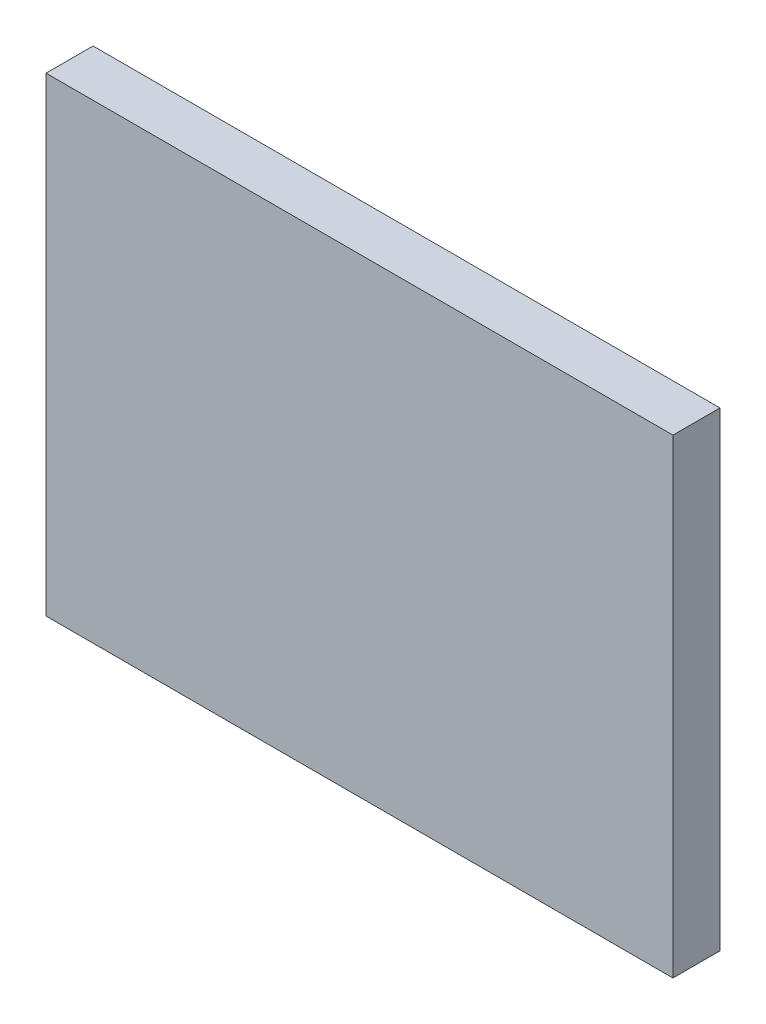
ISO-10303-21;
HEADER;
FILE_DESCRIPTION(('STEP AP214'),'2;1');
FILE_NAME('part.step','',(''),(''),'','','');
FILE_SCHEMA(('AUTOMOTIVE_DESIGN { 1 0 10303 214 1 1 1 1 }'));
ENDSEC;
DATA;
#1=APPLICATION_CONTEXT('core data for automotive mechanical design processes');
#2=APPLICATION_PROTOCOL_DEFINITION('international standard','automotive_design',2000,#1);
#3=PRODUCT_CONTEXT('',#1,'mechanical');
#4=PRODUCT('Part','Part','',(#3));
#5=PRODUCT_RELATED_PRODUCT_CATEGORY('part','',(#4));
#6=PRODUCT_DEFINITION_FORMATION('','',#4);
#7=PRODUCT_DEFINITION_CONTEXT('part definition',#1,'design');
#8=PRODUCT_DEFINITION('design','',#6,#7);
#9=PRODUCT_DEFINITION_SHAPE('','',#8);
#10=(LENGTH_UNIT() NAMED_UNIT(*) SI_UNIT(.MILLI.,.METRE.));
#11=(NAMED_UNIT(*) PLANE_ANGLE_UNIT() SI_UNIT($,.RADIAN.));
#12=(NAMED_UNIT(*) SI_UNIT($,.STERADIAN.) SOLID_ANGLE_UNIT());
#13=UNCERTAINTY_MEASURE_WITH_UNIT(LENGTH_MEASURE(1.E-05),#10,'distance_accuracy_value','');
#14=(GEOMETRIC_REPRESENTATION_CONTEXT(3) GLOBAL_UNCERTAINTY_ASSIGNED_CONTEXT((#13)) GLOBAL_UNIT_ASSIGNED_CONTEXT((#10,
#11,#12)) REPRESENTATION_CONTEXT('',''));
#15=CARTESIAN_POINT('',(0.,0.,0.));
#16=DIRECTION('',(0.,0.,1.));
#17=DIRECTION('',(1.,0.,0.));
#18=AXIS2_PLACEMENT_3D('',#15,#16,#17);
#19=CARTESIAN_POINT('',(0.,0.,3.));
#20=DIRECTION('',(1.,0.,0.));
#21=DIRECTION('',(0.,0.,-1.));
#22=AXIS2_PLACEMENT_3D('',#19,#20,#21);
#23=PLANE('',#22);
#24=DIRECTION('',(0.,-1.,0.));
#25=VECTOR('',#24,1.);
#26=CARTESIAN_POINT('',(0.,0.,0.));
#27=LINE('',#26,#25);
#28=CARTESIAN_POINT('',(0.,30.,0.));
#29=VERTEX_POINT('',#28);
#30=CARTESIAN_POINT('',(0.,0.,0.));
#31=VERTEX_POINT('',#30);
#32=EDGE_CURVE('E96',#29,#31,#27,.T.);
#33=ORIENTED_EDGE('',*,*,#32,.T.);
#34=DIRECTION('',(0.,0.,-1.));
#35=VECTOR('',#34,1.);
#36=CARTESIAN_POINT('',(0.,0.,3.));
#37=LINE('',#36,#35);
#38=CARTESIAN_POINT('',(0.,0.,3.));
#39=VERTEX_POINT('',#38);
#40=EDGE_CURVE('E11',#39,#31,#37,.T.);
#41=ORIENTED_EDGE('',*,*,#40,.F.);
#42=DIRECTION('',(0.,-1.,0.));
#43=VECTOR('',#42,1.);
#44=CARTESIAN_POINT('',(0.,0.,3.));
#45=LINE('',#44,#43);
#46=CARTESIAN_POINT('',(0.,30.,3.));
#47=VERTEX_POINT('',#46);
#48=EDGE_CURVE('E84',#47,#39,#45,.T.);
#49=ORIENTED_EDGE('',*,*,#48,.F.);
#50=DIRECTION('',(0.,0.,-1.));
#51=VECTOR('',#50,1.);
#52=CARTESIAN_POINT('',(0.,30.,3.));
#53=LINE('',#52,#51);
#54=EDGE_CURVE('E92',#47,#29,#53,.T.);
#55=ORIENTED_EDGE('',*,*,#54,.T.);
#56=EDGE_LOOP('',(#33,#41,#49,#55));
#57=FACE_BOUND('',#56,.T.);
#58=ADVANCED_FACE('F33',(#57),#23,.F.);
#59=CARTESIAN_POINT('',(0.,0.,3.));
#60=DIRECTION('',(0.,1.,0.));
#61=DIRECTION('',(0.,0.,1.));
#62=AXIS2_PLACEMENT_3D('',#59,#60,#61);
#63=PLANE('',#62);
#64=DIRECTION('',(1.,0.,0.));
#65=VECTOR('',#64,1.);
#66=CARTESIAN_POINT('',(0.,0.,0.));
#67=LINE('',#66,#65);
#68=CARTESIAN_POINT('',(40.,0.,0.));
#69=VERTEX_POINT('',#68);
#70=EDGE_CURVE('E88',#31,#69,#67,.T.);
#71=ORIENTED_EDGE('',*,*,#70,.T.);
#72=DIRECTION('',(0.,0.,-1.));
#73=VECTOR('',#72,1.);
#74=CARTESIAN_POINT('',(40.,0.,3.));
#75=LINE('',#74,#73);
#76=CARTESIAN_POINT('',(40.,0.,3.));
#77=VERTEX_POINT('',#76);
#78=EDGE_CURVE('E41',#77,#69,#75,.T.);
#79=ORIENTED_EDGE('',*,*,#78,.F.);
#80=DIRECTION('',(1.,0.,0.));
#81=VECTOR('',#80,1.);
#82=CARTESIAN_POINT('',(0.,0.,3.));
#83=LINE('',#82,#81);
#84=EDGE_CURVE('E79',#39,#77,#83,.T.);
#85=ORIENTED_EDGE('',*,*,#84,.F.);
#86=ORIENTED_EDGE('',*,*,#40,.T.);
#87=EDGE_LOOP('',(#71,#79,#85,#86));
#88=FACE_BOUND('',#87,.T.);
#89=ADVANCED_FACE('F87',(#88),#63,.F.);
#90=CARTESIAN_POINT('',(40.,0.,3.));
#91=DIRECTION('',(-1.,0.,0.));
#92=DIRECTION('',(0.,0.,1.));
#93=AXIS2_PLACEMENT_3D('',#90,#91,#92);
#94=PLANE('',#93);
#95=DIRECTION('',(0.,1.,0.));
#96=VECTOR('',#95,1.);
#97=CARTESIAN_POINT('',(40.,0.,0.));
#98=LINE('',#97,#96);
#99=CARTESIAN_POINT('',(40.,30.,0.));
#100=VERTEX_POINT('',#99);
#101=EDGE_CURVE('E66',#69,#100,#98,.T.);
#102=ORIENTED_EDGE('',*,*,#101,.T.);
#103=DIRECTION('',(0.,0.,-1.));
#104=VECTOR('',#103,1.);
#105=CARTESIAN_POINT('',(40.,30.,3.));
#106=LINE('',#105,#104);
#107=CARTESIAN_POINT('',(40.,30.,3.));
#108=VERTEX_POINT('',#107);
#109=EDGE_CURVE('E89',#108,#100,#106,.T.);
#110=ORIENTED_EDGE('',*,*,#109,.F.);
#111=DIRECTION('',(0.,1.,0.));
#112=VECTOR('',#111,1.);
#113=CARTESIAN_POINT('',(40.,0.,3.));
#114=LINE('',#113,#112);
#115=EDGE_CURVE('E82',#77,#108,#114,.T.);
#116=ORIENTED_EDGE('',*,*,#115,.F.);
#117=ORIENTED_EDGE('',*,*,#78,.T.);
#118=EDGE_LOOP('',(#102,#110,#116,#117));
#119=FACE_BOUND('',#118,.T.);
#120=ADVANCED_FACE('F90',(#119),#94,.F.);
#121=CARTESIAN_POINT('',(0.,30.,3.));
#122=DIRECTION('',(0.,-1.,0.));
#123=DIRECTION('',(0.,0.,-1.));
#124=AXIS2_PLACEMENT_3D('',#121,#122,#123);
#125=PLANE('',#124);
#126=DIRECTION('',(-1.,0.,0.));
#127=VECTOR('',#126,1.);
#128=CARTESIAN_POINT('',(0.,30.,0.));
#129=LINE('',#128,#127);
#130=EDGE_CURVE('E72',#100,#29,#129,.T.);
#131=ORIENTED_EDGE('',*,*,#130,.T.);
#132=ORIENTED_EDGE('',*,*,#54,.F.);
#133=DIRECTION('',(-1.,0.,0.));
#134=VECTOR('',#133,1.);
#135=CARTESIAN_POINT('',(0.,30.,3.));
#136=LINE('',#135,#134);
#137=EDGE_CURVE('E49',#108,#47,#136,.T.);
#138=ORIENTED_EDGE('',*,*,#137,.F.);
#139=ORIENTED_EDGE('',*,*,#109,.T.);
#140=EDGE_LOOP('',(#131,#132,#138,#139));
#141=FACE_BOUND('',#140,.T.);
#142=ADVANCED_FACE('F103',(#141),#125,.F.);
#143=CARTESIAN_POINT('',(0.,0.,3.));
#144=DIRECTION('',(0.,0.,-1.));
#145=DIRECTION('',(-1.,0.,0.));
#146=AXIS2_PLACEMENT_3D('',#143,#144,#145);
#147=PLANE('',#146);
#148=ORIENTED_EDGE('',*,*,#48,.T.);
#149=ORIENTED_EDGE('',*,*,#84,.T.);
#150=ORIENTED_EDGE('',*,*,#115,.T.);
#151=ORIENTED_EDGE('',*,*,#137,.T.);
#152=EDGE_LOOP('',(#148,#149,#150,#151));
#153=FACE_BOUND('',#152,.T.);
#154=ADVANCED_FACE('F80',(#153),#147,.F.);
#155=CARTESIAN_POINT('',(0.,0.,0.));
#156=DIRECTION('',(0.,0.,-1.));
#157=DIRECTION('',(-1.,0.,0.));
#158=AXIS2_PLACEMENT_3D('',#155,#156,#157);
#159=PLANE('',#158);
#160=ORIENTED_EDGE('',*,*,#32,.F.);
#161=ORIENTED_EDGE('',*,*,#130,.F.);
#162=ORIENTED_EDGE('',*,*,#101,.F.);
#163=ORIENTED_EDGE('',*,*,#70,.F.);
#164=EDGE_LOOP('',(#160,#161,#162,#163));
#165=FACE_BOUND('',#164,.T.);
#166=ADVANCED_FACE('F106',(#165),#159,.T.);
#167=CLOSED_SHELL('',(#58,#89,#120,#142,#154,#166));
#168=MANIFOLD_SOLID_BREP('B2',#167);
#169=ADVANCED_BREP_SHAPE_REPRESENTATION('',(#18,#168),#14);
#170=SHAPE_DEFINITION_REPRESENTATION(#9,#169);
ENDSEC;
END-ISO-10303-21;
